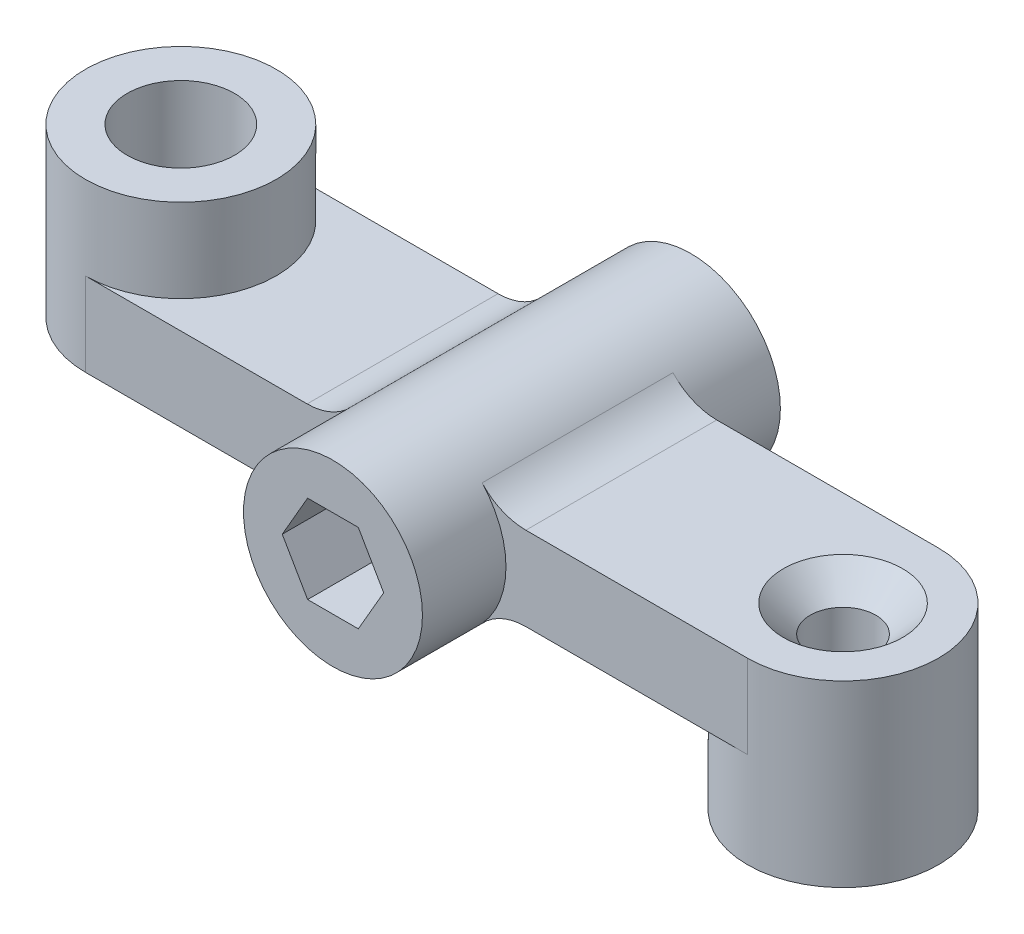
ISO-10303-21;
HEADER;
FILE_DESCRIPTION(('STEP AP214'),'2;1');
FILE_NAME('part.step','',(''),(''),'','','');
FILE_SCHEMA(('AUTOMOTIVE_DESIGN { 1 0 10303 214 1 1 1 1 }'));
ENDSEC;
DATA;
#1=APPLICATION_CONTEXT('core data for automotive mechanical design processes');
#2=APPLICATION_PROTOCOL_DEFINITION('international standard','automotive_design',2000,#1);
#3=PRODUCT_CONTEXT('',#1,'mechanical');
#4=PRODUCT('Part','Part','',(#3));
#5=PRODUCT_RELATED_PRODUCT_CATEGORY('part','',(#4));
#6=PRODUCT_DEFINITION_FORMATION('','',#4);
#7=PRODUCT_DEFINITION_CONTEXT('part definition',#1,'design');
#8=PRODUCT_DEFINITION('design','',#6,#7);
#9=PRODUCT_DEFINITION_SHAPE('','',#8);
#10=(LENGTH_UNIT() NAMED_UNIT(*) SI_UNIT(.MILLI.,.METRE.));
#11=(NAMED_UNIT(*) PLANE_ANGLE_UNIT() SI_UNIT($,.RADIAN.));
#12=(NAMED_UNIT(*) SI_UNIT($,.STERADIAN.) SOLID_ANGLE_UNIT());
#13=UNCERTAINTY_MEASURE_WITH_UNIT(LENGTH_MEASURE(1.E-05),#10,'distance_accuracy_value','');
#14=(GEOMETRIC_REPRESENTATION_CONTEXT(3) GLOBAL_UNCERTAINTY_ASSIGNED_CONTEXT((#13)) GLOBAL_UNIT_ASSIGNED_CONTEXT((#10,
#11,#12)) REPRESENTATION_CONTEXT('',''));
#15=CARTESIAN_POINT('',(0.,0.,0.));
#16=DIRECTION('',(0.,0.,1.));
#17=DIRECTION('',(1.,0.,0.));
#18=AXIS2_PLACEMENT_3D('',#15,#16,#17);
#19=CARTESIAN_POINT('',(0.,14.,-32.));
#20=DIRECTION('',(0.,0.,-1.));
#21=DIRECTION('',(-1.,0.,0.));
#22=AXIS2_PLACEMENT_3D('',#19,#20,#21);
#23=PLANE('',#22);
#24=DIRECTION('',(1.,0.,0.));
#25=VECTOR('',#24,1.);
#26=CARTESIAN_POINT('',(0.,0.,-32.));
#27=LINE('',#26,#25);
#28=CARTESIAN_POINT('',(73.8303027798234,0.,-32.));
#29=VERTEX_POINT('',#28);
#30=CARTESIAN_POINT('',(111.,0.,-32.));
#31=VERTEX_POINT('',#30);
#32=EDGE_CURVE('E305',#29,#31,#27,.T.);
#33=ORIENTED_EDGE('',*,*,#32,.F.);
#34=CARTESIAN_POINT('',(73.8303027798234,-10.,-32.));
#35=DIRECTION('',(0.,0.,-1.));
#36=DIRECTION('',(-1.,0.,0.));
#37=AXIS2_PLACEMENT_3D('',#34,#35,#36);
#38=CIRCLE('',#37,10.);
#39=CARTESIAN_POINT('',(66.498181667894,-3.2,-32.));
#40=VERTEX_POINT('',#39);
#41=EDGE_CURVE('E382',#29,#40,#38,.F.);
#42=ORIENTED_EDGE('',*,*,#41,.T.);
#43=CARTESIAN_POINT('',(55.5,7.,-32.));
#44=DIRECTION('',(0.,0.,-1.));
#45=DIRECTION('',(-1.,0.,0.));
#46=AXIS2_PLACEMENT_3D('',#43,#44,#45);
#47=CIRCLE('',#46,15.);
#48=CARTESIAN_POINT('',(66.498181667894,17.2,-32.));
#49=VERTEX_POINT('',#48);
#50=EDGE_CURVE('E265',#40,#49,#47,.F.);
#51=ORIENTED_EDGE('',*,*,#50,.T.);
#52=CARTESIAN_POINT('',(73.8303027798234,24.,-32.));
#53=DIRECTION('',(0.,0.,-1.));
#54=DIRECTION('',(-1.,0.,0.));
#55=AXIS2_PLACEMENT_3D('',#52,#53,#54);
#56=CIRCLE('',#55,10.);
#57=CARTESIAN_POINT('',(73.8303027798234,14.,-32.));
#58=VERTEX_POINT('',#57);
#59=EDGE_CURVE('E390',#49,#58,#56,.F.);
#60=ORIENTED_EDGE('',*,*,#59,.T.);
#61=DIRECTION('',(1.,0.,0.));
#62=VECTOR('',#61,1.);
#63=CARTESIAN_POINT('',(0.,14.,-32.));
#64=LINE('',#63,#62);
#65=CARTESIAN_POINT('',(111.,14.,-32.));
#66=VERTEX_POINT('',#65);
#67=EDGE_CURVE('E311',#58,#66,#64,.T.);
#68=ORIENTED_EDGE('',*,*,#67,.T.);
#69=DIRECTION('',(0.,-1.,0.));
#70=VECTOR('',#69,1.);
#71=CARTESIAN_POINT('',(111.,14.,-32.));
#72=LINE('',#71,#70);
#73=EDGE_CURVE('E315',#66,#31,#72,.T.);
#74=ORIENTED_EDGE('',*,*,#73,.T.);
#75=EDGE_LOOP('',(#33,#42,#51,#60,#68,#74));
#76=FACE_BOUND('',#75,.T.);
#77=ADVANCED_FACE('F48',(#76),#23,.T.);
#78=CARTESIAN_POINT('',(0.,14.,0.));
#79=DIRECTION('',(0.,0.,-1.));
#80=DIRECTION('',(-1.,0.,0.));
#81=AXIS2_PLACEMENT_3D('',#78,#79,#80);
#82=PLANE('',#81);
#83=CARTESIAN_POINT('',(55.5,7.,0.));
#84=DIRECTION('',(0.,0.,-1.));
#85=DIRECTION('',(-1.,0.,0.));
#86=AXIS2_PLACEMENT_3D('',#83,#84,#85);
#87=CIRCLE('',#86,15.);
#88=CARTESIAN_POINT('',(66.498181667894,-3.2,0.));
#89=VERTEX_POINT('',#88);
#90=CARTESIAN_POINT('',(66.498181667894,17.2,0.));
#91=VERTEX_POINT('',#90);
#92=EDGE_CURVE('E262',#89,#91,#87,.F.);
#93=ORIENTED_EDGE('',*,*,#92,.F.);
#94=CARTESIAN_POINT('',(73.8303027798234,-10.,0.));
#95=DIRECTION('',(0.,0.,-1.));
#96=DIRECTION('',(-1.,0.,0.));
#97=AXIS2_PLACEMENT_3D('',#94,#95,#96);
#98=CIRCLE('',#97,10.);
#99=CARTESIAN_POINT('',(73.8303027798234,0.,0.));
#100=VERTEX_POINT('',#99);
#101=EDGE_CURVE('E379',#89,#100,#98,.T.);
#102=ORIENTED_EDGE('',*,*,#101,.T.);
#103=DIRECTION('',(1.,0.,0.));
#104=VECTOR('',#103,1.);
#105=CARTESIAN_POINT('',(0.,0.,0.));
#106=LINE('',#105,#104);
#107=CARTESIAN_POINT('',(111.,0.,0.));
#108=VERTEX_POINT('',#107);
#109=EDGE_CURVE('E320',#100,#108,#106,.T.);
#110=ORIENTED_EDGE('',*,*,#109,.T.);
#111=DIRECTION('',(0.,-1.,0.));
#112=VECTOR('',#111,1.);
#113=CARTESIAN_POINT('',(111.,14.,0.));
#114=LINE('',#113,#112);
#115=CARTESIAN_POINT('',(111.,14.,0.));
#116=VERTEX_POINT('',#115);
#117=EDGE_CURVE('E328',#116,#108,#114,.T.);
#118=ORIENTED_EDGE('',*,*,#117,.F.);
#119=DIRECTION('',(1.,0.,0.));
#120=VECTOR('',#119,1.);
#121=CARTESIAN_POINT('',(0.,14.,0.));
#122=LINE('',#121,#120);
#123=CARTESIAN_POINT('',(73.8303027798234,14.,0.));
#124=VERTEX_POINT('',#123);
#125=EDGE_CURVE('E310',#124,#116,#122,.T.);
#126=ORIENTED_EDGE('',*,*,#125,.F.);
#127=CARTESIAN_POINT('',(73.8303027798234,24.,0.));
#128=DIRECTION('',(0.,0.,-1.));
#129=DIRECTION('',(-1.,0.,0.));
#130=AXIS2_PLACEMENT_3D('',#127,#128,#129);
#131=CIRCLE('',#130,10.);
#132=EDGE_CURVE('E386',#124,#91,#131,.T.);
#133=ORIENTED_EDGE('',*,*,#132,.T.);
#134=EDGE_LOOP('',(#93,#102,#110,#118,#126,#133));
#135=FACE_BOUND('',#134,.T.);
#136=ADVANCED_FACE('F425',(#135),#82,.F.);
#137=CARTESIAN_POINT('',(0.,14.,0.));
#138=DIRECTION('',(0.,1.,0.));
#139=DIRECTION('',(0.,0.,1.));
#140=AXIS2_PLACEMENT_3D('',#137,#138,#139);
#141=PLANE('',#140);
#142=CARTESIAN_POINT('',(111.,14.,-16.));
#143=DIRECTION('',(0.,1.,0.));
#144=DIRECTION('',(0.,0.,1.));
#145=AXIS2_PLACEMENT_3D('',#142,#143,#144);
#146=CIRCLE('',#145,9.99999999999999);
#147=CARTESIAN_POINT('',(111.,14.,-5.99999999999998));
#148=VERTEX_POINT('',#147);
#149=EDGE_CURVE('E266',#148,#148,#146,.T.);
#150=ORIENTED_EDGE('',*,*,#149,.F.);
#151=EDGE_LOOP('',(#150));
#152=FACE_BOUND('',#151,.T.);
#153=ORIENTED_EDGE('',*,*,#67,.F.);
#154=DIRECTION('',(0.,0.,-1.));
#155=VECTOR('',#154,1.);
#156=CARTESIAN_POINT('',(73.8303027798234,14.,0.));
#157=LINE('',#156,#155);
#158=EDGE_CURVE('E365',#58,#124,#157,.F.);
#159=ORIENTED_EDGE('',*,*,#158,.T.);
#160=ORIENTED_EDGE('',*,*,#125,.T.);
#161=CARTESIAN_POINT('',(111.,14.,-16.));
#162=DIRECTION('',(0.,1.,0.));
#163=DIRECTION('',(0.,0.,1.));
#164=AXIS2_PLACEMENT_3D('',#161,#162,#163);
#165=CIRCLE('',#164,16.);
#166=EDGE_CURVE('E290',#116,#66,#165,.T.);
#167=ORIENTED_EDGE('',*,*,#166,.T.);
#168=EDGE_LOOP('',(#153,#159,#160,#167));
#169=FACE_BOUND('',#168,.T.);
#170=ADVANCED_FACE('F419',(#152,#169),#141,.T.);
#171=CARTESIAN_POINT('',(0.,0.,0.));
#172=DIRECTION('',(0.,1.,0.));
#173=DIRECTION('',(0.,0.,1.));
#174=AXIS2_PLACEMENT_3D('',#171,#172,#173);
#175=PLANE('',#174);
#176=ORIENTED_EDGE('',*,*,#109,.F.);
#177=DIRECTION('',(0.,0.,1.));
#178=VECTOR('',#177,1.);
#179=CARTESIAN_POINT('',(73.8303027798234,0.,-32.));
#180=LINE('',#179,#178);
#181=EDGE_CURVE('E362',#100,#29,#180,.F.);
#182=ORIENTED_EDGE('',*,*,#181,.T.);
#183=ORIENTED_EDGE('',*,*,#32,.T.);
#184=CARTESIAN_POINT('',(111.,0.,-16.));
#185=DIRECTION('',(0.,1.,0.));
#186=DIRECTION('',(0.,0.,1.));
#187=AXIS2_PLACEMENT_3D('',#184,#185,#186);
#188=CIRCLE('',#187,16.);
#189=EDGE_CURVE('E339',#108,#31,#188,.F.);
#190=ORIENTED_EDGE('',*,*,#189,.F.);
#191=EDGE_LOOP('',(#176,#182,#183,#190));
#192=FACE_BOUND('',#191,.T.);
#193=ADVANCED_FACE('F429',(#192),#175,.F.);
#194=CARTESIAN_POINT('',(111.,14.,-16.));
#195=DIRECTION('',(0.,-1.,0.));
#196=DIRECTION('',(0.,0.,-1.));
#197=AXIS2_PLACEMENT_3D('',#194,#195,#196);
#198=CYLINDRICAL_SURFACE('',#197,16.);
#199=CARTESIAN_POINT('',(111.,-16.,-16.));
#200=DIRECTION('',(0.,1.,0.));
#201=DIRECTION('',(0.,0.,1.));
#202=AXIS2_PLACEMENT_3D('',#199,#200,#201);
#203=CIRCLE('',#202,16.);
#204=CARTESIAN_POINT('',(111.,-16.,0.));
#205=VERTEX_POINT('',#204);
#206=EDGE_CURVE('E286',#205,#205,#203,.T.);
#207=ORIENTED_EDGE('',*,*,#206,.T.);
#208=EDGE_LOOP('',(#207));
#209=FACE_BOUND('',#208,.T.);
#210=ORIENTED_EDGE('',*,*,#189,.T.);
#211=ORIENTED_EDGE('',*,*,#73,.F.);
#212=ORIENTED_EDGE('',*,*,#166,.F.);
#213=ORIENTED_EDGE('',*,*,#117,.T.);
#214=EDGE_LOOP('',(#210,#211,#212,#213));
#215=FACE_BOUND('',#214,.T.);
#216=ADVANCED_FACE('F479',(#209,#215),#198,.T.);
#217=CARTESIAN_POINT('',(111.,-16.,-16.));
#218=DIRECTION('',(0.,1.,0.));
#219=DIRECTION('',(0.,0.,1.));
#220=AXIS2_PLACEMENT_3D('',#217,#218,#219);
#221=PLANE('',#220);
#222=CARTESIAN_POINT('',(111.,-16.,-16.));
#223=DIRECTION('',(0.,1.,0.));
#224=DIRECTION('',(0.,0.,1.));
#225=AXIS2_PLACEMENT_3D('',#222,#223,#224);
#226=CIRCLE('',#225,5.49999999999999);
#227=CARTESIAN_POINT('',(111.,-16.,-10.5));
#228=VERTEX_POINT('',#227);
#229=EDGE_CURVE('E274',#228,#228,#226,.T.);
#230=ORIENTED_EDGE('',*,*,#229,.T.);
#231=EDGE_LOOP('',(#230));
#232=FACE_BOUND('',#231,.T.);
#233=ORIENTED_EDGE('',*,*,#206,.F.);
#234=EDGE_LOOP('',(#233));
#235=FACE_BOUND('',#234,.T.);
#236=ADVANCED_FACE('F487',(#232,#235),#221,.F.);
#237=CARTESIAN_POINT('',(111.,14.,-16.));
#238=DIRECTION('',(0.,1.,0.));
#239=DIRECTION('',(0.,0.,1.));
#240=AXIS2_PLACEMENT_3D('',#237,#238,#239);
#241=CYLINDRICAL_SURFACE('',#240,5.49999999999999);
#242=ORIENTED_EDGE('',*,*,#229,.F.);
#243=EDGE_LOOP('',(#242));
#244=FACE_BOUND('',#243,.T.);
#245=CARTESIAN_POINT('',(111.,9.5,-16.));
#246=DIRECTION('',(0.,1.,0.));
#247=DIRECTION('',(0.,0.,1.));
#248=AXIS2_PLACEMENT_3D('',#245,#246,#247);
#249=CIRCLE('',#248,5.49999999999999);
#250=CARTESIAN_POINT('',(111.,9.5,-10.5));
#251=VERTEX_POINT('',#250);
#252=EDGE_CURVE('E270',#251,#251,#249,.T.);
#253=ORIENTED_EDGE('',*,*,#252,.T.);
#254=EDGE_LOOP('',(#253));
#255=FACE_BOUND('',#254,.T.);
#256=ADVANCED_FACE('F493',(#244,#255),#241,.F.);
#257=CARTESIAN_POINT('',(111.,14.,-16.));
#258=DIRECTION('',(0.,1.,0.));
#259=DIRECTION('',(0.,0.,1.));
#260=AXIS2_PLACEMENT_3D('',#257,#258,#259);
#261=CONICAL_SURFACE('',#260,9.99999999999999,0.785398163397449);
#262=ORIENTED_EDGE('',*,*,#252,.F.);
#263=EDGE_LOOP('',(#262));
#264=FACE_BOUND('',#263,.T.);
#265=ORIENTED_EDGE('',*,*,#149,.T.);
#266=EDGE_LOOP('',(#265));
#267=FACE_BOUND('',#266,.T.);
#268=ADVANCED_FACE('F513',(#264,#267),#261,.F.);
#269=CARTESIAN_POINT('',(55.5,7.,14.));
#270=DIRECTION('',(0.,0.,1.));
#271=DIRECTION('',(1.,0.,0.));
#272=AXIS2_PLACEMENT_3D('',#269,#270,#271);
#273=PLANE('',#272);
#274=CARTESIAN_POINT('',(55.5,7.,14.));
#275=DIRECTION('',(0.,0.,1.));
#276=DIRECTION('',(1.,0.,0.));
#277=AXIS2_PLACEMENT_3D('',#274,#275,#276);
#278=CIRCLE('',#277,15.);
#279=CARTESIAN_POINT('',(70.5,7.,14.));
#280=VERTEX_POINT('',#279);
#281=EDGE_CURVE('E186',#280,#280,#278,.T.);
#282=ORIENTED_EDGE('',*,*,#281,.T.);
#283=EDGE_LOOP('',(#282));
#284=FACE_BOUND('',#283,.T.);
#285=DIRECTION('',(-0.5,0.866025403784438,0.));
#286=VECTOR('',#285,1.);
#287=CARTESIAN_POINT('',(64.,7.00000000000003,14.));
#288=LINE('',#287,#286);
#289=CARTESIAN_POINT('',(64.,7.00000000000003,14.));
#290=VERTEX_POINT('',#289);
#291=CARTESIAN_POINT('',(59.75,14.3612159321677,14.));
#292=VERTEX_POINT('',#291);
#293=EDGE_CURVE('E224',#290,#292,#288,.T.);
#294=ORIENTED_EDGE('',*,*,#293,.F.);
#295=DIRECTION('',(0.499999999999999,0.866025403784439,0.));
#296=VECTOR('',#295,1.);
#297=CARTESIAN_POINT('',(59.75,-0.36121593216771,14.));
#298=LINE('',#297,#296);
#299=CARTESIAN_POINT('',(59.75,-0.36121593216771,14.));
#300=VERTEX_POINT('',#299);
#301=EDGE_CURVE('E182',#300,#290,#298,.T.);
#302=ORIENTED_EDGE('',*,*,#301,.F.);
#303=DIRECTION('',(1.,0.,0.));
#304=VECTOR('',#303,1.);
#305=CARTESIAN_POINT('',(51.25,-0.361215932167712,14.));
#306=LINE('',#305,#304);
#307=CARTESIAN_POINT('',(51.25,-0.361215932167712,14.));
#308=VERTEX_POINT('',#307);
#309=EDGE_CURVE('E238',#308,#300,#306,.T.);
#310=ORIENTED_EDGE('',*,*,#309,.F.);
#311=DIRECTION('',(0.5,-0.866025403784439,0.));
#312=VECTOR('',#311,1.);
#313=CARTESIAN_POINT('',(47.,7.,14.));
#314=LINE('',#313,#312);
#315=CARTESIAN_POINT('',(47.,7.,14.));
#316=VERTEX_POINT('',#315);
#317=EDGE_CURVE('E234',#316,#308,#314,.T.);
#318=ORIENTED_EDGE('',*,*,#317,.F.);
#319=DIRECTION('',(-0.499999999999999,-0.866025403784439,0.));
#320=VECTOR('',#319,1.);
#321=CARTESIAN_POINT('',(51.25,14.3612159321677,14.));
#322=LINE('',#321,#320);
#323=CARTESIAN_POINT('',(51.25,14.3612159321677,14.));
#324=VERTEX_POINT('',#323);
#325=EDGE_CURVE('E230',#324,#316,#322,.T.);
#326=ORIENTED_EDGE('',*,*,#325,.F.);
#327=DIRECTION('',(-1.,0.,0.));
#328=VECTOR('',#327,1.);
#329=CARTESIAN_POINT('',(59.75,14.3612159321677,14.));
#330=LINE('',#329,#328);
#331=EDGE_CURVE('E227',#292,#324,#330,.T.);
#332=ORIENTED_EDGE('',*,*,#331,.F.);
#333=EDGE_LOOP('',(#294,#302,#310,#318,#326,#332));
#334=FACE_BOUND('',#333,.T.);
#335=ADVANCED_FACE('F517',(#284,#334),#273,.T.);
#336=CARTESIAN_POINT('',(55.5,7.,14.));
#337=DIRECTION('',(0.,0.,-1.));
#338=DIRECTION('',(-1.,0.,0.));
#339=AXIS2_PLACEMENT_3D('',#336,#337,#338);
#340=CYLINDRICAL_SURFACE('',#339,15.);
#341=DIRECTION('',(0.,0.,-1.));
#342=VECTOR('',#341,1.);
#343=CARTESIAN_POINT('',(66.498181667894,-3.2,14.));
#344=LINE('',#343,#342);
#345=EDGE_CURVE('E351',#40,#89,#344,.F.);
#346=ORIENTED_EDGE('',*,*,#345,.T.);
#347=ORIENTED_EDGE('',*,*,#92,.T.);
#348=DIRECTION('',(0.,0.,-1.));
#349=VECTOR('',#348,1.);
#350=CARTESIAN_POINT('',(66.498181667894,17.2,14.));
#351=LINE('',#350,#349);
#352=EDGE_CURVE('E347',#91,#49,#351,.T.);
#353=ORIENTED_EDGE('',*,*,#352,.T.);
#354=ORIENTED_EDGE('',*,*,#50,.F.);
#355=EDGE_LOOP('',(#346,#347,#353,#354));
#356=FACE_BOUND('',#355,.T.);
#357=DIRECTION('',(0.,0.,-1.));
#358=VECTOR('',#357,1.);
#359=CARTESIAN_POINT('',(44.501818332106,-3.2,14.));
#360=LINE('',#359,#358);
#361=CARTESIAN_POINT('',(44.501818332106,-3.2,0.));
#362=VERTEX_POINT('',#361);
#363=CARTESIAN_POINT('',(44.501818332106,-3.2,-32.));
#364=VERTEX_POINT('',#363);
#365=EDGE_CURVE('E355',#362,#364,#360,.T.);
#366=ORIENTED_EDGE('',*,*,#365,.T.);
#367=CARTESIAN_POINT('',(44.501818332106,17.2,-32.));
#368=VERTEX_POINT('',#367);
#369=EDGE_CURVE('E261',#368,#364,#47,.F.);
#370=ORIENTED_EDGE('',*,*,#369,.F.);
#371=DIRECTION('',(0.,0.,-1.));
#372=VECTOR('',#371,1.);
#373=CARTESIAN_POINT('',(44.501818332106,17.2,14.));
#374=LINE('',#373,#372);
#375=CARTESIAN_POINT('',(44.501818332106,17.2,0.));
#376=VERTEX_POINT('',#375);
#377=EDGE_CURVE('E343',#368,#376,#374,.F.);
#378=ORIENTED_EDGE('',*,*,#377,.T.);
#379=EDGE_CURVE('E258',#376,#362,#87,.F.);
#380=ORIENTED_EDGE('',*,*,#379,.T.);
#381=EDGE_LOOP('',(#366,#370,#378,#380));
#382=FACE_BOUND('',#381,.T.);
#383=ORIENTED_EDGE('',*,*,#281,.F.);
#384=EDGE_LOOP('',(#383));
#385=FACE_BOUND('',#384,.T.);
#386=CARTESIAN_POINT('',(55.5,7.,-46.));
#387=DIRECTION('',(0.,0.,1.));
#388=DIRECTION('',(1.,0.,0.));
#389=AXIS2_PLACEMENT_3D('',#386,#387,#388);
#390=CIRCLE('',#389,15.);
#391=CARTESIAN_POINT('',(70.5,7.,-46.));
#392=VERTEX_POINT('',#391);
#393=EDGE_CURVE('E218',#392,#392,#390,.T.);
#394=ORIENTED_EDGE('',*,*,#393,.T.);
#395=EDGE_LOOP('',(#394));
#396=FACE_BOUND('',#395,.T.);
#397=ADVANCED_FACE('F399',(#356,#382,#385,#396),#340,.T.);
#398=CARTESIAN_POINT('',(59.75,-0.36121593216771,14.));
#399=DIRECTION('',(-0.866025403784439,0.499999999999999,0.));
#400=DIRECTION('',(-0.499999999999999,-0.866025403784439,0.));
#401=AXIS2_PLACEMENT_3D('',#398,#399,#400);
#402=PLANE('',#401);
#403=ORIENTED_EDGE('',*,*,#301,.T.);
#404=DIRECTION('',(0.,0.,-1.));
#405=VECTOR('',#404,1.);
#406=CARTESIAN_POINT('',(64.,7.00000000000003,14.));
#407=LINE('',#406,#405);
#408=CARTESIAN_POINT('',(64.,7.00000000000003,-46.));
#409=VERTEX_POINT('',#408);
#410=EDGE_CURVE('E174',#290,#409,#407,.T.);
#411=ORIENTED_EDGE('',*,*,#410,.T.);
#412=DIRECTION('',(0.499999999999999,0.866025403784439,0.));
#413=VECTOR('',#412,1.);
#414=CARTESIAN_POINT('',(59.75,-0.36121593216771,-46.));
#415=LINE('',#414,#413);
#416=CARTESIAN_POINT('',(59.75,-0.36121593216771,-46.));
#417=VERTEX_POINT('',#416);
#418=EDGE_CURVE('E179',#417,#409,#415,.T.);
#419=ORIENTED_EDGE('',*,*,#418,.F.);
#420=DIRECTION('',(0.,0.,-1.));
#421=VECTOR('',#420,1.);
#422=CARTESIAN_POINT('',(59.75,-0.36121593216771,14.));
#423=LINE('',#422,#421);
#424=EDGE_CURVE('E241',#300,#417,#423,.T.);
#425=ORIENTED_EDGE('',*,*,#424,.F.);
#426=EDGE_LOOP('',(#403,#411,#419,#425));
#427=FACE_BOUND('',#426,.T.);
#428=ADVANCED_FACE('F176',(#427),#402,.T.);
#429=CARTESIAN_POINT('',(64.,7.00000000000003,14.));
#430=DIRECTION('',(-0.866025403784438,-0.5,0.));
#431=DIRECTION('',(0.5,-0.866025403784438,0.));
#432=AXIS2_PLACEMENT_3D('',#429,#430,#431);
#433=PLANE('',#432);
#434=ORIENTED_EDGE('',*,*,#410,.F.);
#435=ORIENTED_EDGE('',*,*,#293,.T.);
#436=DIRECTION('',(0.,0.,-1.));
#437=VECTOR('',#436,1.);
#438=CARTESIAN_POINT('',(59.75,14.3612159321677,14.));
#439=LINE('',#438,#437);
#440=CARTESIAN_POINT('',(59.75,14.3612159321677,-46.));
#441=VERTEX_POINT('',#440);
#442=EDGE_CURVE('E187',#292,#441,#439,.T.);
#443=ORIENTED_EDGE('',*,*,#442,.T.);
#444=DIRECTION('',(-0.5,0.866025403784438,0.));
#445=VECTOR('',#444,1.);
#446=CARTESIAN_POINT('',(64.,7.00000000000003,-46.));
#447=LINE('',#446,#445);
#448=EDGE_CURVE('E190',#409,#441,#447,.T.);
#449=ORIENTED_EDGE('',*,*,#448,.F.);
#450=EDGE_LOOP('',(#434,#435,#443,#449));
#451=FACE_BOUND('',#450,.T.);
#452=ADVANCED_FACE('F191',(#451),#433,.T.);
#453=CARTESIAN_POINT('',(59.75,14.3612159321677,14.));
#454=DIRECTION('',(0.,-1.,0.));
#455=DIRECTION('',(1.,0.,0.));
#456=AXIS2_PLACEMENT_3D('',#453,#454,#455);
#457=PLANE('',#456);
#458=DIRECTION('',(0.,0.,-1.));
#459=VECTOR('',#458,1.);
#460=CARTESIAN_POINT('',(51.25,14.3612159321677,14.));
#461=LINE('',#460,#459);
#462=CARTESIAN_POINT('',(51.25,14.3612159321677,-46.));
#463=VERTEX_POINT('',#462);
#464=EDGE_CURVE('E250',#324,#463,#461,.T.);
#465=ORIENTED_EDGE('',*,*,#464,.T.);
#466=DIRECTION('',(-1.,0.,0.));
#467=VECTOR('',#466,1.);
#468=CARTESIAN_POINT('',(59.75,14.3612159321677,-46.));
#469=LINE('',#468,#467);
#470=EDGE_CURVE('E197',#441,#463,#469,.T.);
#471=ORIENTED_EDGE('',*,*,#470,.F.);
#472=ORIENTED_EDGE('',*,*,#442,.F.);
#473=ORIENTED_EDGE('',*,*,#331,.T.);
#474=EDGE_LOOP('',(#465,#471,#472,#473));
#475=FACE_BOUND('',#474,.T.);
#476=ADVANCED_FACE('F528',(#475),#457,.T.);
#477=CARTESIAN_POINT('',(51.25,14.3612159321677,14.));
#478=DIRECTION('',(0.866025403784439,-0.499999999999999,0.));
#479=DIRECTION('',(0.499999999999999,0.866025403784439,0.));
#480=AXIS2_PLACEMENT_3D('',#477,#478,#479);
#481=PLANE('',#480);
#482=ORIENTED_EDGE('',*,*,#325,.T.);
#483=DIRECTION('',(0.,0.,-1.));
#484=VECTOR('',#483,1.);
#485=CARTESIAN_POINT('',(47.,7.,14.));
#486=LINE('',#485,#484);
#487=CARTESIAN_POINT('',(47.,7.,-46.));
#488=VERTEX_POINT('',#487);
#489=EDGE_CURVE('E247',#316,#488,#486,.T.);
#490=ORIENTED_EDGE('',*,*,#489,.T.);
#491=DIRECTION('',(-0.499999999999999,-0.866025403784439,0.));
#492=VECTOR('',#491,1.);
#493=CARTESIAN_POINT('',(51.25,14.3612159321677,-46.));
#494=LINE('',#493,#492);
#495=EDGE_CURVE('E209',#463,#488,#494,.T.);
#496=ORIENTED_EDGE('',*,*,#495,.F.);
#497=ORIENTED_EDGE('',*,*,#464,.F.);
#498=EDGE_LOOP('',(#482,#490,#496,#497));
#499=FACE_BOUND('',#498,.T.);
#500=ADVANCED_FACE('F531',(#499),#481,.T.);
#501=CARTESIAN_POINT('',(47.,7.,14.));
#502=DIRECTION('',(0.866025403784439,0.5,0.));
#503=DIRECTION('',(-0.5,0.866025403784439,0.));
#504=AXIS2_PLACEMENT_3D('',#501,#502,#503);
#505=PLANE('',#504);
#506=ORIENTED_EDGE('',*,*,#489,.F.);
#507=ORIENTED_EDGE('',*,*,#317,.T.);
#508=DIRECTION('',(0.,0.,-1.));
#509=VECTOR('',#508,1.);
#510=CARTESIAN_POINT('',(51.25,-0.361215932167712,14.));
#511=LINE('',#510,#509);
#512=CARTESIAN_POINT('',(51.25,-0.361215932167712,-46.));
#513=VERTEX_POINT('',#512);
#514=EDGE_CURVE('E244',#308,#513,#511,.T.);
#515=ORIENTED_EDGE('',*,*,#514,.T.);
#516=DIRECTION('',(0.5,-0.866025403784439,0.));
#517=VECTOR('',#516,1.);
#518=CARTESIAN_POINT('',(47.,7.,-46.));
#519=LINE('',#518,#517);
#520=EDGE_CURVE('E213',#488,#513,#519,.T.);
#521=ORIENTED_EDGE('',*,*,#520,.F.);
#522=EDGE_LOOP('',(#506,#507,#515,#521));
#523=FACE_BOUND('',#522,.T.);
#524=ADVANCED_FACE('F535',(#523),#505,.T.);
#525=CARTESIAN_POINT('',(51.25,-0.361215932167712,14.));
#526=DIRECTION('',(0.,1.,0.));
#527=DIRECTION('',(-1.,0.,0.));
#528=AXIS2_PLACEMENT_3D('',#525,#526,#527);
#529=PLANE('',#528);
#530=ORIENTED_EDGE('',*,*,#424,.T.);
#531=DIRECTION('',(1.,0.,0.));
#532=VECTOR('',#531,1.);
#533=CARTESIAN_POINT('',(51.25,-0.361215932167712,-46.));
#534=LINE('',#533,#532);
#535=EDGE_CURVE('E203',#513,#417,#534,.T.);
#536=ORIENTED_EDGE('',*,*,#535,.F.);
#537=ORIENTED_EDGE('',*,*,#514,.F.);
#538=ORIENTED_EDGE('',*,*,#309,.T.);
#539=EDGE_LOOP('',(#530,#536,#537,#538));
#540=FACE_BOUND('',#539,.T.);
#541=ADVANCED_FACE('F539',(#540),#529,.T.);
#542=CARTESIAN_POINT('',(55.5,7.,-46.));
#543=DIRECTION('',(0.,0.,1.));
#544=DIRECTION('',(1.,0.,0.));
#545=AXIS2_PLACEMENT_3D('',#542,#543,#544);
#546=PLANE('',#545);
#547=ORIENTED_EDGE('',*,*,#535,.T.);
#548=ORIENTED_EDGE('',*,*,#418,.T.);
#549=ORIENTED_EDGE('',*,*,#448,.T.);
#550=ORIENTED_EDGE('',*,*,#470,.T.);
#551=ORIENTED_EDGE('',*,*,#495,.T.);
#552=ORIENTED_EDGE('',*,*,#520,.T.);
#553=EDGE_LOOP('',(#547,#548,#549,#550,#551,#552));
#554=FACE_BOUND('',#553,.T.);
#555=ORIENTED_EDGE('',*,*,#393,.F.);
#556=EDGE_LOOP('',(#555));
#557=FACE_BOUND('',#556,.T.);
#558=ADVANCED_FACE('F199',(#554,#557),#546,.F.);
#559=CARTESIAN_POINT('',(0.,28.,0.));
#560=DIRECTION('',(0.,1.,0.));
#561=DIRECTION('',(0.,0.,1.));
#562=AXIS2_PLACEMENT_3D('',#559,#560,#561);
#563=PLANE('',#562);
#564=CARTESIAN_POINT('',(0.,28.,-16.));
#565=DIRECTION('',(0.,1.,0.));
#566=DIRECTION('',(0.,0.,1.));
#567=AXIS2_PLACEMENT_3D('',#564,#565,#566);
#568=CIRCLE('',#567,9.);
#569=CARTESIAN_POINT('',(0.,28.,-7.));
#570=VERTEX_POINT('',#569);
#571=EDGE_CURVE('E278',#570,#570,#568,.T.);
#572=ORIENTED_EDGE('',*,*,#571,.F.);
#573=EDGE_LOOP('',(#572));
#574=FACE_BOUND('',#573,.T.);
#575=CARTESIAN_POINT('',(0.,28.,-16.));
#576=DIRECTION('',(0.,1.,0.));
#577=DIRECTION('',(0.,0.,1.));
#578=AXIS2_PLACEMENT_3D('',#575,#576,#577);
#579=CIRCLE('',#578,16.);
#580=CARTESIAN_POINT('',(0.,28.,0.));
#581=VERTEX_POINT('',#580);
#582=EDGE_CURVE('E295',#581,#581,#579,.T.);
#583=ORIENTED_EDGE('',*,*,#582,.T.);
#584=EDGE_LOOP('',(#583));
#585=FACE_BOUND('',#584,.T.);
#586=ADVANCED_FACE('F498',(#574,#585),#563,.T.);
#587=CARTESIAN_POINT('',(0.,28.,-16.));
#588=DIRECTION('',(0.,-1.,0.));
#589=DIRECTION('',(0.,0.,-1.));
#590=AXIS2_PLACEMENT_3D('',#587,#588,#589);
#591=CYLINDRICAL_SURFACE('',#590,16.);
#592=DIRECTION('',(0.,-1.,0.));
#593=VECTOR('',#592,1.);
#594=CARTESIAN_POINT('',(0.,14.,-32.));
#595=LINE('',#594,#593);
#596=CARTESIAN_POINT('',(0.,14.,-32.));
#597=VERTEX_POINT('',#596);
#598=CARTESIAN_POINT('',(0.,0.,-32.));
#599=VERTEX_POINT('',#598);
#600=EDGE_CURVE('E336',#597,#599,#595,.T.);
#601=ORIENTED_EDGE('',*,*,#600,.T.);
#602=CARTESIAN_POINT('',(0.,0.,-16.));
#603=DIRECTION('',(0.,1.,0.));
#604=DIRECTION('',(0.,0.,1.));
#605=AXIS2_PLACEMENT_3D('',#602,#603,#604);
#606=CIRCLE('',#605,16.);
#607=CARTESIAN_POINT('',(0.,0.,0.));
#608=VERTEX_POINT('',#607);
#609=EDGE_CURVE('E294',#599,#608,#606,.T.);
#610=ORIENTED_EDGE('',*,*,#609,.T.);
#611=DIRECTION('',(0.,-1.,0.));
#612=VECTOR('',#611,1.);
#613=CARTESIAN_POINT('',(0.,14.,0.));
#614=LINE('',#613,#612);
#615=CARTESIAN_POINT('',(0.,14.,0.));
#616=VERTEX_POINT('',#615);
#617=EDGE_CURVE('E332',#616,#608,#614,.T.);
#618=ORIENTED_EDGE('',*,*,#617,.F.);
#619=CARTESIAN_POINT('',(0.,14.,-16.));
#620=DIRECTION('',(0.,1.,0.));
#621=DIRECTION('',(0.,0.,1.));
#622=AXIS2_PLACEMENT_3D('',#619,#620,#621);
#623=CIRCLE('',#622,16.);
#624=EDGE_CURVE('E299',#597,#616,#623,.F.);
#625=ORIENTED_EDGE('',*,*,#624,.F.);
#626=EDGE_LOOP('',(#601,#610,#618,#625));
#627=FACE_BOUND('',#626,.T.);
#628=ORIENTED_EDGE('',*,*,#582,.F.);
#629=EDGE_LOOP('',(#628));
#630=FACE_BOUND('',#629,.T.);
#631=ADVANCED_FACE('F412',(#627,#630),#591,.T.);
#632=CARTESIAN_POINT('',(0.,28.,-16.));
#633=DIRECTION('',(0.,1.,0.));
#634=DIRECTION('',(0.,0.,1.));
#635=AXIS2_PLACEMENT_3D('',#632,#633,#634);
#636=CYLINDRICAL_SURFACE('',#635,9.);
#637=CARTESIAN_POINT('',(0.,0.,-16.));
#638=DIRECTION('',(0.,1.,0.));
#639=DIRECTION('',(0.,0.,1.));
#640=AXIS2_PLACEMENT_3D('',#637,#638,#639);
#641=CIRCLE('',#640,9.);
#642=CARTESIAN_POINT('',(0.,0.,-7.));
#643=VERTEX_POINT('',#642);
#644=EDGE_CURVE('E282',#643,#643,#641,.T.);
#645=ORIENTED_EDGE('',*,*,#644,.F.);
#646=EDGE_LOOP('',(#645));
#647=FACE_BOUND('',#646,.T.);
#648=ORIENTED_EDGE('',*,*,#571,.T.);
#649=EDGE_LOOP('',(#648));
#650=FACE_BOUND('',#649,.T.);
#651=ADVANCED_FACE('F426',(#647,#650),#636,.F.);
#652=ORIENTED_EDGE('',*,*,#644,.T.);
#653=EDGE_LOOP('',(#652));
#654=FACE_BOUND('',#653,.T.);
#655=CARTESIAN_POINT('',(37.1696972201766,0.,-32.));
#656=VERTEX_POINT('',#655);
#657=EDGE_CURVE('E316',#599,#656,#27,.T.);
#658=ORIENTED_EDGE('',*,*,#657,.T.);
#659=DIRECTION('',(0.,0.,1.));
#660=VECTOR('',#659,1.);
#661=CARTESIAN_POINT('',(37.1696972201766,0.,0.));
#662=LINE('',#661,#660);
#663=CARTESIAN_POINT('',(37.1696972201766,0.,0.));
#664=VERTEX_POINT('',#663);
#665=EDGE_CURVE('E359',#656,#664,#662,.T.);
#666=ORIENTED_EDGE('',*,*,#665,.T.);
#667=EDGE_CURVE('E321',#608,#664,#106,.T.);
#668=ORIENTED_EDGE('',*,*,#667,.F.);
#669=ORIENTED_EDGE('',*,*,#609,.F.);
#670=EDGE_LOOP('',(#658,#666,#668,#669));
#671=FACE_BOUND('',#670,.T.);
#672=ADVANCED_FACE('F409',(#654,#671),#175,.F.);
#673=CARTESIAN_POINT('',(37.1696972201766,14.,0.));
#674=VERTEX_POINT('',#673);
#675=EDGE_CURVE('E312',#616,#674,#122,.T.);
#676=ORIENTED_EDGE('',*,*,#675,.T.);
#677=DIRECTION('',(0.,0.,-1.));
#678=VECTOR('',#677,1.);
#679=CARTESIAN_POINT('',(37.1696972201766,14.,0.));
#680=LINE('',#679,#678);
#681=CARTESIAN_POINT('',(37.1696972201766,14.,-32.));
#682=VERTEX_POINT('',#681);
#683=EDGE_CURVE('E369',#674,#682,#680,.T.);
#684=ORIENTED_EDGE('',*,*,#683,.T.);
#685=EDGE_CURVE('E306',#597,#682,#64,.T.);
#686=ORIENTED_EDGE('',*,*,#685,.F.);
#687=ORIENTED_EDGE('',*,*,#624,.T.);
#688=EDGE_LOOP('',(#676,#684,#686,#687));
#689=FACE_BOUND('',#688,.T.);
#690=ADVANCED_FACE('F416',(#689),#141,.T.);
#691=ORIENTED_EDGE('',*,*,#379,.F.);
#692=CARTESIAN_POINT('',(37.1696972201766,24.,0.));
#693=DIRECTION('',(0.,0.,-1.));
#694=DIRECTION('',(-1.,0.,0.));
#695=AXIS2_PLACEMENT_3D('',#692,#693,#694);
#696=CIRCLE('',#695,10.);
#697=EDGE_CURVE('E12',#376,#674,#696,.T.);
#698=ORIENTED_EDGE('',*,*,#697,.T.);
#699=ORIENTED_EDGE('',*,*,#675,.F.);
#700=ORIENTED_EDGE('',*,*,#617,.T.);
#701=ORIENTED_EDGE('',*,*,#667,.T.);
#702=CARTESIAN_POINT('',(37.1696972201766,-10.,0.));
#703=DIRECTION('',(0.,0.,-1.));
#704=DIRECTION('',(-1.,0.,0.));
#705=AXIS2_PLACEMENT_3D('',#702,#703,#704);
#706=CIRCLE('',#705,10.);
#707=EDGE_CURVE('E375',#664,#362,#706,.T.);
#708=ORIENTED_EDGE('',*,*,#707,.T.);
#709=EDGE_LOOP('',(#691,#698,#699,#700,#701,#708));
#710=FACE_BOUND('',#709,.T.);
#711=ADVANCED_FACE('F414',(#710),#82,.F.);
#712=ORIENTED_EDGE('',*,*,#685,.T.);
#713=CARTESIAN_POINT('',(37.1696972201766,24.,-32.));
#714=DIRECTION('',(0.,0.,-1.));
#715=DIRECTION('',(-1.,0.,0.));
#716=AXIS2_PLACEMENT_3D('',#713,#714,#715);
#717=CIRCLE('',#716,10.);
#718=EDGE_CURVE('E57',#682,#368,#717,.F.);
#719=ORIENTED_EDGE('',*,*,#718,.T.);
#720=ORIENTED_EDGE('',*,*,#369,.T.);
#721=CARTESIAN_POINT('',(37.1696972201766,-10.,-32.));
#722=DIRECTION('',(0.,0.,-1.));
#723=DIRECTION('',(-1.,0.,0.));
#724=AXIS2_PLACEMENT_3D('',#721,#722,#723);
#725=CIRCLE('',#724,10.);
#726=EDGE_CURVE('E372',#364,#656,#725,.F.);
#727=ORIENTED_EDGE('',*,*,#726,.T.);
#728=ORIENTED_EDGE('',*,*,#657,.F.);
#729=ORIENTED_EDGE('',*,*,#600,.F.);
#730=EDGE_LOOP('',(#712,#719,#720,#727,#728,#729));
#731=FACE_BOUND('',#730,.T.);
#732=ADVANCED_FACE('F394',(#731),#23,.T.);
#733=CARTESIAN_POINT('',(37.1696972201766,-10.,14.));
#734=DIRECTION('',(0.,0.,-1.));
#735=DIRECTION('',(-1.,0.,0.));
#736=AXIS2_PLACEMENT_3D('',#733,#734,#735);
#737=CYLINDRICAL_SURFACE('',#736,10.);
#738=ORIENTED_EDGE('',*,*,#707,.F.);
#739=ORIENTED_EDGE('',*,*,#665,.F.);
#740=ORIENTED_EDGE('',*,*,#726,.F.);
#741=ORIENTED_EDGE('',*,*,#365,.F.);
#742=EDGE_LOOP('',(#738,#739,#740,#741));
#743=FACE_BOUND('',#742,.T.);
#744=ADVANCED_FACE('F404',(#743),#737,.F.);
#745=CARTESIAN_POINT('',(73.8303027798234,-10.,14.));
#746=DIRECTION('',(0.,0.,-1.));
#747=DIRECTION('',(-1.,0.,0.));
#748=AXIS2_PLACEMENT_3D('',#745,#746,#747);
#749=CYLINDRICAL_SURFACE('',#748,10.);
#750=ORIENTED_EDGE('',*,*,#41,.F.);
#751=ORIENTED_EDGE('',*,*,#181,.F.);
#752=ORIENTED_EDGE('',*,*,#101,.F.);
#753=ORIENTED_EDGE('',*,*,#345,.F.);
#754=EDGE_LOOP('',(#750,#751,#752,#753));
#755=FACE_BOUND('',#754,.T.);
#756=ADVANCED_FACE('F446',(#755),#749,.F.);
#757=CARTESIAN_POINT('',(73.8303027798234,24.,14.));
#758=DIRECTION('',(0.,0.,-1.));
#759=DIRECTION('',(-1.,0.,0.));
#760=AXIS2_PLACEMENT_3D('',#757,#758,#759);
#761=CYLINDRICAL_SURFACE('',#760,10.);
#762=ORIENTED_EDGE('',*,*,#59,.F.);
#763=ORIENTED_EDGE('',*,*,#352,.F.);
#764=ORIENTED_EDGE('',*,*,#132,.F.);
#765=ORIENTED_EDGE('',*,*,#158,.F.);
#766=EDGE_LOOP('',(#762,#763,#764,#765));
#767=FACE_BOUND('',#766,.T.);
#768=ADVANCED_FACE('F450',(#767),#761,.F.);
#769=CARTESIAN_POINT('',(37.1696972201766,24.,14.));
#770=DIRECTION('',(0.,0.,-1.));
#771=DIRECTION('',(-1.,0.,0.));
#772=AXIS2_PLACEMENT_3D('',#769,#770,#771);
#773=CYLINDRICAL_SURFACE('',#772,10.);
#774=ORIENTED_EDGE('',*,*,#697,.F.);
#775=ORIENTED_EDGE('',*,*,#377,.F.);
#776=ORIENTED_EDGE('',*,*,#718,.F.);
#777=ORIENTED_EDGE('',*,*,#683,.F.);
#778=EDGE_LOOP('',(#774,#775,#776,#777));
#779=FACE_BOUND('',#778,.T.);
#780=ADVANCED_FACE('F50',(#779),#773,.F.);
#781=CLOSED_SHELL('',(#77,#136,#170,#193,#216,#236,#256,#268,#335,#397,#428,#452,#476,#500,#524,
#541,#558,#586,#631,#651,#672,#690,#711,#732,#744,#756,#768,#780));
#782=MANIFOLD_SOLID_BREP('B2',#781);
#783=ADVANCED_BREP_SHAPE_REPRESENTATION('',(#18,#782),#14);
#784=SHAPE_DEFINITION_REPRESENTATION(#9,#783);
ENDSEC;
END-ISO-10303-21;
